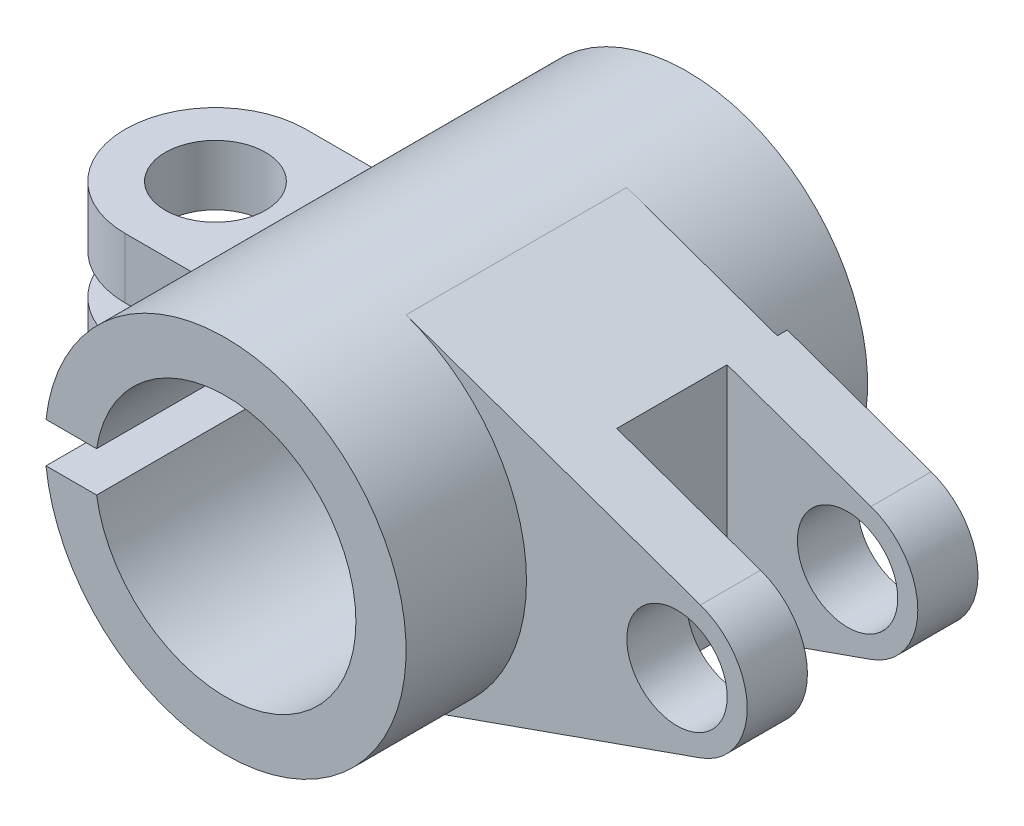
ISO-10303-21;
HEADER;
FILE_DESCRIPTION(('STEP AP214'),'2;1');
FILE_NAME('part.step','',(''),(''),'','','');
FILE_SCHEMA(('AUTOMOTIVE_DESIGN { 1 0 10303 214 1 1 1 1 }'));
ENDSEC;
DATA;
#1=APPLICATION_CONTEXT('core data for automotive mechanical design processes');
#2=APPLICATION_PROTOCOL_DEFINITION('international standard','automotive_design',2000,#1);
#3=PRODUCT_CONTEXT('',#1,'mechanical');
#4=PRODUCT('Part','Part','',(#3));
#5=PRODUCT_RELATED_PRODUCT_CATEGORY('part','',(#4));
#6=PRODUCT_DEFINITION_FORMATION('','',#4);
#7=PRODUCT_DEFINITION_CONTEXT('part definition',#1,'design');
#8=PRODUCT_DEFINITION('design','',#6,#7);
#9=PRODUCT_DEFINITION_SHAPE('','',#8);
#10=(LENGTH_UNIT() NAMED_UNIT(*) SI_UNIT(.MILLI.,.METRE.));
#11=(NAMED_UNIT(*) PLANE_ANGLE_UNIT() SI_UNIT($,.RADIAN.));
#12=(NAMED_UNIT(*) SI_UNIT($,.STERADIAN.) SOLID_ANGLE_UNIT());
#13=UNCERTAINTY_MEASURE_WITH_UNIT(LENGTH_MEASURE(1.E-05),#10,'distance_accuracy_value','');
#14=(GEOMETRIC_REPRESENTATION_CONTEXT(3) GLOBAL_UNCERTAINTY_ASSIGNED_CONTEXT((#13)) GLOBAL_UNIT_ASSIGNED_CONTEXT((#10,
#11,#12)) REPRESENTATION_CONTEXT('',''));
#15=CARTESIAN_POINT('',(0.,0.,0.));
#16=DIRECTION('',(0.,0.,1.));
#17=DIRECTION('',(1.,0.,0.));
#18=AXIS2_PLACEMENT_3D('',#15,#16,#17);
#19=CARTESIAN_POINT('',(-24.,-2.,0.));
#20=DIRECTION('',(0.,1.,0.));
#21=DIRECTION('',(0.,0.,1.));
#22=AXIS2_PLACEMENT_3D('',#19,#20,#21);
#23=CYLINDRICAL_SURFACE('',#22,9.);
#24=DIRECTION('',(0.,1.,0.));
#25=VECTOR('',#24,1.);
#26=CARTESIAN_POINT('',(-24.,0.,9.));
#27=LINE('',#26,#25);
#28=CARTESIAN_POINT('',(-24.,-2.,9.));
#29=VERTEX_POINT('',#28);
#30=CARTESIAN_POINT('',(-24.,-8.00000000000001,9.));
#31=VERTEX_POINT('',#30);
#32=EDGE_CURVE('E440',#29,#31,#27,.F.);
#33=ORIENTED_EDGE('',*,*,#32,.F.);
#34=CARTESIAN_POINT('',(-24.,-2.,0.));
#35=DIRECTION('',(0.,1.,0.));
#36=DIRECTION('',(-1.,0.,0.));
#37=AXIS2_PLACEMENT_3D('',#34,#35,#36);
#38=CIRCLE('',#37,9.);
#39=CARTESIAN_POINT('',(-24.,-2.,-9.));
#40=VERTEX_POINT('',#39);
#41=EDGE_CURVE('E57',#40,#29,#38,.T.);
#42=ORIENTED_EDGE('',*,*,#41,.F.);
#43=DIRECTION('',(0.,-1.,0.));
#44=VECTOR('',#43,1.);
#45=CARTESIAN_POINT('',(-24.,-2.,-9.));
#46=LINE('',#45,#44);
#47=CARTESIAN_POINT('',(-24.,-8.00000000000001,-9.));
#48=VERTEX_POINT('',#47);
#49=EDGE_CURVE('E444',#48,#40,#46,.F.);
#50=ORIENTED_EDGE('',*,*,#49,.F.);
#51=CARTESIAN_POINT('',(-24.,-8.00000000000001,0.));
#52=DIRECTION('',(0.,-1.,0.));
#53=DIRECTION('',(1.,0.,0.));
#54=AXIS2_PLACEMENT_3D('',#51,#52,#53);
#55=CIRCLE('',#54,9.);
#56=EDGE_CURVE('E11',#31,#48,#55,.T.);
#57=ORIENTED_EDGE('',*,*,#56,.F.);
#58=EDGE_LOOP('',(#33,#42,#50,#57));
#59=FACE_BOUND('',#58,.T.);
#60=ADVANCED_FACE('F47',(#59),#23,.T.);
#61=CARTESIAN_POINT('',(-24.,2.,0.));
#62=DIRECTION('',(0.,-1.,0.));
#63=DIRECTION('',(0.,0.,-1.));
#64=AXIS2_PLACEMENT_3D('',#61,#62,#63);
#65=CYLINDRICAL_SURFACE('',#64,9.);
#66=DIRECTION('',(0.,-1.,0.));
#67=VECTOR('',#66,1.);
#68=CARTESIAN_POINT('',(-24.,0.,-9.));
#69=LINE('',#68,#67);
#70=CARTESIAN_POINT('',(-24.,2.,-9.));
#71=VERTEX_POINT('',#70);
#72=CARTESIAN_POINT('',(-24.,8.,-9.));
#73=VERTEX_POINT('',#72);
#74=EDGE_CURVE('E428',#71,#73,#69,.F.);
#75=ORIENTED_EDGE('',*,*,#74,.F.);
#76=CARTESIAN_POINT('',(-24.,2.,0.));
#77=DIRECTION('',(0.,1.,0.));
#78=DIRECTION('',(0.,0.,1.));
#79=AXIS2_PLACEMENT_3D('',#76,#77,#78);
#80=CIRCLE('',#79,9.);
#81=CARTESIAN_POINT('',(-24.,2.,9.));
#82=VERTEX_POINT('',#81);
#83=EDGE_CURVE('E435',#82,#71,#80,.F.);
#84=ORIENTED_EDGE('',*,*,#83,.F.);
#85=DIRECTION('',(0.,1.,0.));
#86=VECTOR('',#85,1.);
#87=CARTESIAN_POINT('',(-24.,2.,9.));
#88=LINE('',#87,#86);
#89=CARTESIAN_POINT('',(-24.,8.,9.));
#90=VERTEX_POINT('',#89);
#91=EDGE_CURVE('E432',#90,#82,#88,.F.);
#92=ORIENTED_EDGE('',*,*,#91,.F.);
#93=CARTESIAN_POINT('',(-24.,8.,0.));
#94=DIRECTION('',(0.,-1.,0.));
#95=DIRECTION('',(1.,0.,0.));
#96=AXIS2_PLACEMENT_3D('',#93,#94,#95);
#97=CIRCLE('',#96,9.);
#98=EDGE_CURVE('E202',#73,#90,#97,.F.);
#99=ORIENTED_EDGE('',*,*,#98,.F.);
#100=EDGE_LOOP('',(#75,#84,#92,#99));
#101=FACE_BOUND('',#100,.T.);
#102=ADVANCED_FACE('F522',(#101),#65,.T.);
#103=CARTESIAN_POINT('',(21.,0.,11.));
#104=DIRECTION('',(1.,0.,0.));
#105=DIRECTION('',(0.,1.,0.));
#106=AXIS2_PLACEMENT_3D('',#103,#104,#105);
#107=PLANE('',#106);
#108=DIRECTION('',(0.,-1.,0.));
#109=VECTOR('',#108,1.);
#110=CARTESIAN_POINT('',(21.,0.,-6.));
#111=LINE('',#110,#109);
#112=CARTESIAN_POINT('',(21.,11.667261889578,-6.));
#113=VERTEX_POINT('',#112);
#114=CARTESIAN_POINT('',(21.,-11.667261889578,-6.));
#115=VERTEX_POINT('',#114);
#116=EDGE_CURVE('E265',#113,#115,#111,.T.);
#117=ORIENTED_EDGE('',*,*,#116,.F.);
#118=DIRECTION('',(0.,0.,-1.));
#119=VECTOR('',#118,1.);
#120=CARTESIAN_POINT('',(21.,11.667261889578,11.));
#121=LINE('',#120,#119);
#122=CARTESIAN_POINT('',(21.,11.667261889578,5.));
#123=VERTEX_POINT('',#122);
#124=EDGE_CURVE('E370',#123,#113,#121,.T.);
#125=ORIENTED_EDGE('',*,*,#124,.F.);
#126=DIRECTION('',(0.,-1.,0.));
#127=VECTOR('',#126,1.);
#128=CARTESIAN_POINT('',(21.,0.,5.));
#129=LINE('',#128,#127);
#130=CARTESIAN_POINT('',(21.,-11.667261889578,5.));
#131=VERTEX_POINT('',#130);
#132=EDGE_CURVE('E313',#123,#131,#129,.T.);
#133=ORIENTED_EDGE('',*,*,#132,.T.);
#134=DIRECTION('',(0.,0.,-1.));
#135=VECTOR('',#134,1.);
#136=CARTESIAN_POINT('',(21.,-11.667261889578,11.));
#137=LINE('',#136,#135);
#138=EDGE_CURVE('E374',#131,#115,#137,.T.);
#139=ORIENTED_EDGE('',*,*,#138,.T.);
#140=EDGE_LOOP('',(#117,#125,#133,#139));
#141=FACE_BOUND('',#140,.T.);
#142=ADVANCED_FACE('F527',(#141),#107,.T.);
#143=CARTESIAN_POINT('',(0.,0.,23.));
#144=DIRECTION('',(0.,0.,-1.));
#145=DIRECTION('',(-1.,0.,0.));
#146=AXIS2_PLACEMENT_3D('',#143,#144,#145);
#147=CYLINDRICAL_SURFACE('',#146,18.);
#148=DIRECTION('',(0.,0.,-1.));
#149=VECTOR('',#148,1.);
#150=CARTESIAN_POINT('',(6.00000000000001,-16.9705627484772,11.));
#151=LINE('',#150,#149);
#152=CARTESIAN_POINT('',(6.00000000000001,-16.9705627484771,11.));
#153=VERTEX_POINT('',#152);
#154=CARTESIAN_POINT('',(6.,-16.9705627484771,-11.));
#155=VERTEX_POINT('',#154);
#156=EDGE_CURVE('E378',#153,#155,#151,.T.);
#157=ORIENTED_EDGE('',*,*,#156,.F.);
#158=CARTESIAN_POINT('',(0.,0.,11.));
#159=DIRECTION('',(0.,0.,1.));
#160=DIRECTION('',(1.,0.,0.));
#161=AXIS2_PLACEMENT_3D('',#158,#159,#160);
#162=CIRCLE('',#161,18.);
#163=CARTESIAN_POINT('',(6.00000000000001,16.9705627484771,11.));
#164=VERTEX_POINT('',#163);
#165=EDGE_CURVE('E343',#153,#164,#162,.T.);
#166=ORIENTED_EDGE('',*,*,#165,.T.);
#167=DIRECTION('',(0.,0.,-1.));
#168=VECTOR('',#167,1.);
#169=CARTESIAN_POINT('',(6.00000000000001,16.9705627484772,11.));
#170=LINE('',#169,#168);
#171=CARTESIAN_POINT('',(6.00000000000001,16.9705627484772,-11.));
#172=VERTEX_POINT('',#171);
#173=EDGE_CURVE('E353',#164,#172,#170,.T.);
#174=ORIENTED_EDGE('',*,*,#173,.T.);
#175=CARTESIAN_POINT('',(0.,0.,-11.));
#176=DIRECTION('',(0.,0.,1.));
#177=DIRECTION('',(1.,0.,0.));
#178=AXIS2_PLACEMENT_3D('',#175,#176,#177);
#179=CIRCLE('',#178,18.);
#180=EDGE_CURVE('E342',#155,#172,#179,.T.);
#181=ORIENTED_EDGE('',*,*,#180,.F.);
#182=EDGE_LOOP('',(#157,#166,#174,#181));
#183=FACE_BOUND('',#182,.T.);
#184=DIRECTION('',(0.,0.,-1.));
#185=VECTOR('',#184,1.);
#186=CARTESIAN_POINT('',(-16.1245154965971,8.,9.));
#187=LINE('',#186,#185);
#188=CARTESIAN_POINT('',(-16.1245154965971,8.,9.));
#189=VERTEX_POINT('',#188);
#190=CARTESIAN_POINT('',(-16.1245154965971,8.,-9.));
#191=VERTEX_POINT('',#190);
#192=EDGE_CURVE('E200',#189,#191,#187,.T.);
#193=ORIENTED_EDGE('',*,*,#192,.F.);
#194=CARTESIAN_POINT('',(0.,0.,9.));
#195=DIRECTION('',(0.,0.,1.));
#196=DIRECTION('',(1.,0.,0.));
#197=AXIS2_PLACEMENT_3D('',#194,#195,#196);
#198=CIRCLE('',#197,18.);
#199=CARTESIAN_POINT('',(-17.8885438199983,2.,9.));
#200=VERTEX_POINT('',#199);
#201=EDGE_CURVE('E208',#189,#200,#198,.T.);
#202=ORIENTED_EDGE('',*,*,#201,.T.);
#203=DIRECTION('',(0.,0.,-1.));
#204=VECTOR('',#203,1.);
#205=CARTESIAN_POINT('',(-17.8885438199983,2.,23.));
#206=LINE('',#205,#204);
#207=CARTESIAN_POINT('',(-17.8885438199983,2.,23.));
#208=VERTEX_POINT('',#207);
#209=EDGE_CURVE('E425',#208,#200,#206,.T.);
#210=ORIENTED_EDGE('',*,*,#209,.F.);
#211=CARTESIAN_POINT('',(0.,0.,23.));
#212=DIRECTION('',(0.,0.,1.));
#213=DIRECTION('',(1.,0.,0.));
#214=AXIS2_PLACEMENT_3D('',#211,#212,#213);
#215=CIRCLE('',#214,18.);
#216=CARTESIAN_POINT('',(-17.8885438199983,-2.,23.));
#217=VERTEX_POINT('',#216);
#218=EDGE_CURVE('E383',#217,#208,#215,.T.);
#219=ORIENTED_EDGE('',*,*,#218,.F.);
#220=DIRECTION('',(0.,0.,-1.));
#221=VECTOR('',#220,1.);
#222=CARTESIAN_POINT('',(-17.8885438199983,-2.,23.));
#223=LINE('',#222,#221);
#224=CARTESIAN_POINT('',(-17.8885438199983,-2.,9.));
#225=VERTEX_POINT('',#224);
#226=EDGE_CURVE('E414',#217,#225,#223,.T.);
#227=ORIENTED_EDGE('',*,*,#226,.T.);
#228=CARTESIAN_POINT('',(0.,0.,9.));
#229=DIRECTION('',(0.,0.,1.));
#230=DIRECTION('',(1.,0.,0.));
#231=AXIS2_PLACEMENT_3D('',#228,#229,#230);
#232=CIRCLE('',#231,18.);
#233=CARTESIAN_POINT('',(-16.1245154965971,-8.00000000000001,9.));
#234=VERTEX_POINT('',#233);
#235=EDGE_CURVE('E236',#225,#234,#232,.T.);
#236=ORIENTED_EDGE('',*,*,#235,.T.);
#237=DIRECTION('',(0.,0.,-1.));
#238=VECTOR('',#237,1.);
#239=CARTESIAN_POINT('',(-16.1245154965971,-8.00000000000001,9.));
#240=LINE('',#239,#238);
#241=CARTESIAN_POINT('',(-16.1245154965971,-8.00000000000001,-9.));
#242=VERTEX_POINT('',#241);
#243=EDGE_CURVE('E246',#234,#242,#240,.T.);
#244=ORIENTED_EDGE('',*,*,#243,.T.);
#245=CARTESIAN_POINT('',(0.,0.,-9.));
#246=DIRECTION('',(0.,0.,1.));
#247=DIRECTION('',(1.,0.,0.));
#248=AXIS2_PLACEMENT_3D('',#245,#246,#247);
#249=CIRCLE('',#248,18.);
#250=CARTESIAN_POINT('',(-17.8885438199983,-2.,-9.));
#251=VERTEX_POINT('',#250);
#252=EDGE_CURVE('E247',#251,#242,#249,.T.);
#253=ORIENTED_EDGE('',*,*,#252,.F.);
#254=CARTESIAN_POINT('',(-17.8885438199983,-2.,-23.));
#255=VERTEX_POINT('',#254);
#256=EDGE_CURVE('E399',#251,#255,#223,.T.);
#257=ORIENTED_EDGE('',*,*,#256,.T.);
#258=CARTESIAN_POINT('',(0.,0.,-23.));
#259=DIRECTION('',(0.,0.,1.));
#260=DIRECTION('',(1.,0.,0.));
#261=AXIS2_PLACEMENT_3D('',#258,#259,#260);
#262=CIRCLE('',#261,18.);
#263=CARTESIAN_POINT('',(-17.8885438199983,2.,-23.));
#264=VERTEX_POINT('',#263);
#265=EDGE_CURVE('E382',#255,#264,#262,.T.);
#266=ORIENTED_EDGE('',*,*,#265,.T.);
#267=CARTESIAN_POINT('',(-17.8885438199983,2.,-9.));
#268=VERTEX_POINT('',#267);
#269=EDGE_CURVE('E424',#268,#264,#206,.T.);
#270=ORIENTED_EDGE('',*,*,#269,.F.);
#271=CARTESIAN_POINT('',(0.,0.,-9.));
#272=DIRECTION('',(0.,0.,1.));
#273=DIRECTION('',(1.,0.,0.));
#274=AXIS2_PLACEMENT_3D('',#271,#272,#273);
#275=CIRCLE('',#274,18.);
#276=EDGE_CURVE('E223',#191,#268,#275,.T.);
#277=ORIENTED_EDGE('',*,*,#276,.F.);
#278=EDGE_LOOP('',(#193,#202,#210,#219,#227,#236,#244,#253,#257,#266,#270,#277));
#279=FACE_BOUND('',#278,.T.);
#280=ADVANCED_FACE('F220',(#183,#279),#147,.T.);
#281=CARTESIAN_POINT('',(0.,2.,23.));
#282=DIRECTION('',(0.,1.,0.));
#283=DIRECTION('',(0.,0.,1.));
#284=AXIS2_PLACEMENT_3D('',#281,#282,#283);
#285=PLANE('',#284);
#286=CARTESIAN_POINT('',(-24.,2.,0.));
#287=DIRECTION('',(0.,1.,0.));
#288=DIRECTION('',(0.,0.,1.));
#289=AXIS2_PLACEMENT_3D('',#286,#287,#288);
#290=CIRCLE('',#289,4.99999999999999);
#291=CARTESIAN_POINT('',(-24.,2.,4.99999999999999));
#292=VERTEX_POINT('',#291);
#293=EDGE_CURVE('E491',#292,#292,#290,.T.);
#294=ORIENTED_EDGE('',*,*,#293,.T.);
#295=EDGE_LOOP('',(#294));
#296=FACE_BOUND('',#295,.T.);
#297=DIRECTION('',(1.,0.,0.));
#298=VECTOR('',#297,1.);
#299=CARTESIAN_POINT('',(0.,2.,9.));
#300=LINE('',#299,#298);
#301=EDGE_CURVE('E207',#82,#200,#300,.T.);
#302=ORIENTED_EDGE('',*,*,#301,.F.);
#303=ORIENTED_EDGE('',*,*,#83,.T.);
#304=DIRECTION('',(1.,0.,0.));
#305=VECTOR('',#304,1.);
#306=CARTESIAN_POINT('',(0.,2.,-9.));
#307=LINE('',#306,#305);
#308=EDGE_CURVE('E217',#71,#268,#307,.T.);
#309=ORIENTED_EDGE('',*,*,#308,.T.);
#310=ORIENTED_EDGE('',*,*,#269,.T.);
#311=DIRECTION('',(1.,0.,0.));
#312=VECTOR('',#311,1.);
#313=CARTESIAN_POINT('',(0.,2.,-23.));
#314=LINE('',#313,#312);
#315=CARTESIAN_POINT('',(-12.8452325786651,2.,-23.));
#316=VERTEX_POINT('',#315);
#317=EDGE_CURVE('E403',#264,#316,#314,.T.);
#318=ORIENTED_EDGE('',*,*,#317,.T.);
#319=DIRECTION('',(0.,0.,-1.));
#320=VECTOR('',#319,1.);
#321=CARTESIAN_POINT('',(-12.8452325786651,2.,23.));
#322=LINE('',#321,#320);
#323=CARTESIAN_POINT('',(-12.8452325786651,2.,23.));
#324=VERTEX_POINT('',#323);
#325=EDGE_CURVE('E421',#324,#316,#322,.T.);
#326=ORIENTED_EDGE('',*,*,#325,.F.);
#327=DIRECTION('',(1.,0.,0.));
#328=VECTOR('',#327,1.);
#329=CARTESIAN_POINT('',(0.,2.,23.));
#330=LINE('',#329,#328);
#331=EDGE_CURVE('E387',#208,#324,#330,.T.);
#332=ORIENTED_EDGE('',*,*,#331,.F.);
#333=ORIENTED_EDGE('',*,*,#209,.T.);
#334=EDGE_LOOP('',(#302,#303,#309,#310,#318,#326,#332,#333));
#335=FACE_BOUND('',#334,.T.);
#336=ADVANCED_FACE('F476',(#296,#335),#285,.F.);
#337=CARTESIAN_POINT('',(0.,0.,23.));
#338=DIRECTION('',(0.,0.,-1.));
#339=DIRECTION('',(-1.,0.,0.));
#340=AXIS2_PLACEMENT_3D('',#337,#338,#339);
#341=CYLINDRICAL_SURFACE('',#340,13.);
#342=CARTESIAN_POINT('',(0.,0.,-23.));
#343=DIRECTION('',(0.,0.,1.));
#344=DIRECTION('',(1.,0.,0.));
#345=AXIS2_PLACEMENT_3D('',#342,#343,#344);
#346=CIRCLE('',#345,13.);
#347=CARTESIAN_POINT('',(-12.8452325786651,-2.,-23.));
#348=VERTEX_POINT('',#347);
#349=EDGE_CURVE('E407',#348,#316,#346,.T.);
#350=ORIENTED_EDGE('',*,*,#349,.F.);
#351=DIRECTION('',(0.,0.,-1.));
#352=VECTOR('',#351,1.);
#353=CARTESIAN_POINT('',(-12.8452325786651,-2.,23.));
#354=LINE('',#353,#352);
#355=CARTESIAN_POINT('',(-12.8452325786651,-2.,23.));
#356=VERTEX_POINT('',#355);
#357=EDGE_CURVE('E418',#356,#348,#354,.T.);
#358=ORIENTED_EDGE('',*,*,#357,.F.);
#359=CARTESIAN_POINT('',(0.,0.,23.));
#360=DIRECTION('',(0.,0.,1.));
#361=DIRECTION('',(1.,0.,0.));
#362=AXIS2_PLACEMENT_3D('',#359,#360,#361);
#363=CIRCLE('',#362,13.);
#364=EDGE_CURVE('E391',#356,#324,#363,.T.);
#365=ORIENTED_EDGE('',*,*,#364,.T.);
#366=ORIENTED_EDGE('',*,*,#325,.T.);
#367=EDGE_LOOP('',(#350,#358,#365,#366));
#368=FACE_BOUND('',#367,.T.);
#369=ADVANCED_FACE('F473',(#368),#341,.F.);
#370=CARTESIAN_POINT('',(0.,-2.,23.));
#371=DIRECTION('',(0.,1.,0.));
#372=DIRECTION('',(-1.,0.,0.));
#373=AXIS2_PLACEMENT_3D('',#370,#371,#372);
#374=PLANE('',#373);
#375=CARTESIAN_POINT('',(-24.,-2.,0.));
#376=DIRECTION('',(0.,1.,0.));
#377=DIRECTION('',(-1.,0.,0.));
#378=AXIS2_PLACEMENT_3D('',#375,#376,#377);
#379=CIRCLE('',#378,4.99999999999999);
#380=CARTESIAN_POINT('',(-29.,-2.,0.));
#381=VERTEX_POINT('',#380);
#382=EDGE_CURVE('E252',#381,#381,#379,.T.);
#383=ORIENTED_EDGE('',*,*,#382,.F.);
#384=EDGE_LOOP('',(#383));
#385=FACE_BOUND('',#384,.T.);
#386=DIRECTION('',(1.,0.,0.));
#387=VECTOR('',#386,1.);
#388=CARTESIAN_POINT('',(0.,-2.,-9.));
#389=LINE('',#388,#387);
#390=EDGE_CURVE('E251',#40,#251,#389,.T.);
#391=ORIENTED_EDGE('',*,*,#390,.F.);
#392=ORIENTED_EDGE('',*,*,#41,.T.);
#393=DIRECTION('',(1.,0.,0.));
#394=VECTOR('',#393,1.);
#395=CARTESIAN_POINT('',(0.,-2.,9.));
#396=LINE('',#395,#394);
#397=EDGE_CURVE('E239',#29,#225,#396,.T.);
#398=ORIENTED_EDGE('',*,*,#397,.T.);
#399=ORIENTED_EDGE('',*,*,#226,.F.);
#400=DIRECTION('',(1.,0.,0.));
#401=VECTOR('',#400,1.);
#402=CARTESIAN_POINT('',(0.,-2.,23.));
#403=LINE('',#402,#401);
#404=EDGE_CURVE('E395',#217,#356,#403,.T.);
#405=ORIENTED_EDGE('',*,*,#404,.T.);
#406=ORIENTED_EDGE('',*,*,#357,.T.);
#407=DIRECTION('',(1.,0.,0.));
#408=VECTOR('',#407,1.);
#409=CARTESIAN_POINT('',(0.,-2.,-23.));
#410=LINE('',#409,#408);
#411=EDGE_CURVE('E388',#255,#348,#410,.T.);
#412=ORIENTED_EDGE('',*,*,#411,.F.);
#413=ORIENTED_EDGE('',*,*,#256,.F.);
#414=EDGE_LOOP('',(#391,#392,#398,#399,#405,#406,#412,#413));
#415=FACE_BOUND('',#414,.T.);
#416=ADVANCED_FACE('F450',(#385,#415),#374,.T.);
#417=CARTESIAN_POINT('',(0.,0.,23.));
#418=DIRECTION('',(0.,0.,1.));
#419=DIRECTION('',(1.,0.,0.));
#420=AXIS2_PLACEMENT_3D('',#417,#418,#419);
#421=PLANE('',#420);
#422=ORIENTED_EDGE('',*,*,#218,.T.);
#423=ORIENTED_EDGE('',*,*,#331,.T.);
#424=ORIENTED_EDGE('',*,*,#364,.F.);
#425=ORIENTED_EDGE('',*,*,#404,.F.);
#426=EDGE_LOOP('',(#422,#423,#424,#425));
#427=FACE_BOUND('',#426,.T.);
#428=ADVANCED_FACE('F548',(#427),#421,.T.);
#429=CARTESIAN_POINT('',(0.,0.,-23.));
#430=DIRECTION('',(0.,0.,1.));
#431=DIRECTION('',(1.,0.,0.));
#432=AXIS2_PLACEMENT_3D('',#429,#430,#431);
#433=PLANE('',#432);
#434=ORIENTED_EDGE('',*,*,#265,.F.);
#435=ORIENTED_EDGE('',*,*,#411,.T.);
#436=ORIENTED_EDGE('',*,*,#349,.T.);
#437=ORIENTED_EDGE('',*,*,#317,.F.);
#438=EDGE_LOOP('',(#434,#435,#436,#437));
#439=FACE_BOUND('',#438,.T.);
#440=ADVANCED_FACE('F468',(#439),#433,.F.);
#441=CARTESIAN_POINT('',(6.00000000000001,-16.9705627484772,11.));
#442=DIRECTION('',(-0.333333333333334,0.942809041582063,0.));
#443=DIRECTION('',(-0.942809041582063,-0.333333333333334,0.));
#444=AXIS2_PLACEMENT_3D('',#441,#442,#443);
#445=PLANE('',#444);
#446=DIRECTION('',(0.942809041582063,0.333333333333334,0.));
#447=VECTOR('',#446,1.);
#448=CARTESIAN_POINT('',(6.00000000000001,-16.9705627484772,-11.));
#449=LINE('',#448,#447);
#450=CARTESIAN_POINT('',(21.,-11.667261889578,-11.));
#451=VERTEX_POINT('',#450);
#452=EDGE_CURVE('E357',#155,#451,#449,.T.);
#453=ORIENTED_EDGE('',*,*,#452,.T.);
#454=DIRECTION('',(0.,0.,1.));
#455=VECTOR('',#454,1.);
#456=CARTESIAN_POINT('',(21.,-11.667261889578,-12.));
#457=LINE('',#456,#455);
#458=CARTESIAN_POINT('',(21.,-11.667261889578,-12.));
#459=VERTEX_POINT('',#458);
#460=EDGE_CURVE('E295',#459,#451,#457,.T.);
#461=ORIENTED_EDGE('',*,*,#460,.F.);
#462=DIRECTION('',(0.942809041582063,0.333333333333334,0.));
#463=VECTOR('',#462,1.);
#464=CARTESIAN_POINT('',(6.00000000000001,-16.9705627484772,-12.));
#465=LINE('',#464,#463);
#466=CARTESIAN_POINT('',(35.3333333333333,-6.59966329107444,-12.));
#467=VERTEX_POINT('',#466);
#468=EDGE_CURVE('E264',#459,#467,#465,.T.);
#469=ORIENTED_EDGE('',*,*,#468,.T.);
#470=DIRECTION('',(0.,0.,1.));
#471=VECTOR('',#470,1.);
#472=CARTESIAN_POINT('',(35.3333333333333,-6.59966329107444,-12.));
#473=LINE('',#472,#471);
#474=CARTESIAN_POINT('',(35.3333333333333,-6.59966329107444,-6.));
#475=VERTEX_POINT('',#474);
#476=EDGE_CURVE('E279',#467,#475,#473,.T.);
#477=ORIENTED_EDGE('',*,*,#476,.T.);
#478=DIRECTION('',(0.942809041582063,0.333333333333334,0.));
#479=VECTOR('',#478,1.);
#480=CARTESIAN_POINT('',(6.00000000000001,-16.9705627484772,-6.));
#481=LINE('',#480,#479);
#482=EDGE_CURVE('E230',#115,#475,#481,.T.);
#483=ORIENTED_EDGE('',*,*,#482,.F.);
#484=ORIENTED_EDGE('',*,*,#138,.F.);
#485=DIRECTION('',(0.942809041582063,0.333333333333334,0.));
#486=VECTOR('',#485,1.);
#487=CARTESIAN_POINT('',(6.00000000000001,-16.9705627484772,5.));
#488=LINE('',#487,#486);
#489=CARTESIAN_POINT('',(35.3333333333333,-6.59966329107444,5.));
#490=VERTEX_POINT('',#489);
#491=EDGE_CURVE('E321',#131,#490,#488,.T.);
#492=ORIENTED_EDGE('',*,*,#491,.T.);
#493=DIRECTION('',(0.,0.,-1.));
#494=VECTOR('',#493,1.);
#495=CARTESIAN_POINT('',(35.3333333333333,-6.59966329107444,11.));
#496=LINE('',#495,#494);
#497=CARTESIAN_POINT('',(35.3333333333333,-6.59966329107444,11.));
#498=VERTEX_POINT('',#497);
#499=EDGE_CURVE('E338',#498,#490,#496,.T.);
#500=ORIENTED_EDGE('',*,*,#499,.F.);
#501=DIRECTION('',(0.942809041582063,0.333333333333334,0.));
#502=VECTOR('',#501,1.);
#503=CARTESIAN_POINT('',(6.00000000000001,-16.9705627484772,11.));
#504=LINE('',#503,#502);
#505=EDGE_CURVE('E346',#153,#498,#504,.T.);
#506=ORIENTED_EDGE('',*,*,#505,.F.);
#507=ORIENTED_EDGE('',*,*,#156,.T.);
#508=EDGE_LOOP('',(#453,#461,#469,#477,#483,#484,#492,#500,#506,#507));
#509=FACE_BOUND('',#508,.T.);
#510=ADVANCED_FACE('F552',(#509),#445,.F.);
#511=CARTESIAN_POINT('',(6.00000000000001,16.9705627484772,11.));
#512=DIRECTION('',(0.333333333333333,0.942809041582063,0.));
#513=DIRECTION('',(-0.942809041582063,0.333333333333333,0.));
#514=AXIS2_PLACEMENT_3D('',#511,#512,#513);
#515=PLANE('',#514);
#516=DIRECTION('',(0.942809041582063,-0.333333333333333,0.));
#517=VECTOR('',#516,1.);
#518=CARTESIAN_POINT('',(6.00000000000001,16.9705627484772,-11.));
#519=LINE('',#518,#517);
#520=CARTESIAN_POINT('',(21.,11.667261889578,-11.));
#521=VERTEX_POINT('',#520);
#522=EDGE_CURVE('E347',#172,#521,#519,.T.);
#523=ORIENTED_EDGE('',*,*,#522,.F.);
#524=ORIENTED_EDGE('',*,*,#173,.F.);
#525=DIRECTION('',(0.942809041582063,-0.333333333333333,0.));
#526=VECTOR('',#525,1.);
#527=CARTESIAN_POINT('',(6.00000000000001,16.9705627484772,11.));
#528=LINE('',#527,#526);
#529=CARTESIAN_POINT('',(35.3333333333333,6.59966329107445,11.));
#530=VERTEX_POINT('',#529);
#531=EDGE_CURVE('E350',#164,#530,#528,.T.);
#532=ORIENTED_EDGE('',*,*,#531,.T.);
#533=DIRECTION('',(0.,0.,-1.));
#534=VECTOR('',#533,1.);
#535=CARTESIAN_POINT('',(35.3333333333333,6.59966329107445,11.));
#536=LINE('',#535,#534);
#537=CARTESIAN_POINT('',(35.3333333333333,6.59966329107445,5.));
#538=VERTEX_POINT('',#537);
#539=EDGE_CURVE('E317',#530,#538,#536,.T.);
#540=ORIENTED_EDGE('',*,*,#539,.T.);
#541=DIRECTION('',(0.942809041582063,-0.333333333333333,0.));
#542=VECTOR('',#541,1.);
#543=CARTESIAN_POINT('',(6.00000000000001,16.9705627484772,5.));
#544=LINE('',#543,#542);
#545=EDGE_CURVE('E329',#123,#538,#544,.T.);
#546=ORIENTED_EDGE('',*,*,#545,.F.);
#547=ORIENTED_EDGE('',*,*,#124,.T.);
#548=DIRECTION('',(0.942809041582063,-0.333333333333333,0.));
#549=VECTOR('',#548,1.);
#550=CARTESIAN_POINT('',(6.00000000000001,16.9705627484772,-6.));
#551=LINE('',#550,#549);
#552=CARTESIAN_POINT('',(35.3333333333333,6.59966329107445,-6.));
#553=VERTEX_POINT('',#552);
#554=EDGE_CURVE('E288',#113,#553,#551,.T.);
#555=ORIENTED_EDGE('',*,*,#554,.T.);
#556=DIRECTION('',(0.,0.,1.));
#557=VECTOR('',#556,1.);
#558=CARTESIAN_POINT('',(35.3333333333333,6.59966329107445,-12.));
#559=LINE('',#558,#557);
#560=CARTESIAN_POINT('',(35.3333333333333,6.59966329107445,-12.));
#561=VERTEX_POINT('',#560);
#562=EDGE_CURVE('E303',#561,#553,#559,.T.);
#563=ORIENTED_EDGE('',*,*,#562,.F.);
#564=DIRECTION('',(0.942809041582063,-0.333333333333333,0.));
#565=VECTOR('',#564,1.);
#566=CARTESIAN_POINT('',(6.00000000000001,16.9705627484772,-12.));
#567=LINE('',#566,#565);
#568=CARTESIAN_POINT('',(21.,11.667261889578,-12.));
#569=VERTEX_POINT('',#568);
#570=EDGE_CURVE('E273',#569,#561,#567,.T.);
#571=ORIENTED_EDGE('',*,*,#570,.F.);
#572=DIRECTION('',(0.,0.,1.));
#573=VECTOR('',#572,1.);
#574=CARTESIAN_POINT('',(21.,11.667261889578,-12.));
#575=LINE('',#574,#573);
#576=EDGE_CURVE('E299',#569,#521,#575,.T.);
#577=ORIENTED_EDGE('',*,*,#576,.T.);
#578=EDGE_LOOP('',(#523,#524,#532,#540,#546,#547,#555,#563,#571,#577));
#579=FACE_BOUND('',#578,.T.);
#580=ADVANCED_FACE('F557',(#579),#515,.T.);
#581=CARTESIAN_POINT('',(0.,0.,11.));
#582=DIRECTION('',(0.,0.,1.));
#583=DIRECTION('',(1.,0.,0.));
#584=AXIS2_PLACEMENT_3D('',#581,#582,#583);
#585=PLANE('',#584);
#586=ORIENTED_EDGE('',*,*,#165,.F.);
#587=ORIENTED_EDGE('',*,*,#505,.T.);
#588=CARTESIAN_POINT('',(33.,0.,11.));
#589=DIRECTION('',(0.,0.,1.));
#590=DIRECTION('',(1.,0.,0.));
#591=AXIS2_PLACEMENT_3D('',#588,#589,#590);
#592=CIRCLE('',#591,7.);
#593=EDGE_CURVE('E312',#498,#530,#592,.T.);
#594=ORIENTED_EDGE('',*,*,#593,.T.);
#595=ORIENTED_EDGE('',*,*,#531,.F.);
#596=EDGE_LOOP('',(#586,#587,#594,#595));
#597=FACE_BOUND('',#596,.T.);
#598=CARTESIAN_POINT('',(33.,0.,11.));
#599=DIRECTION('',(0.,0.,1.));
#600=DIRECTION('',(1.,0.,0.));
#601=AXIS2_PLACEMENT_3D('',#598,#599,#600);
#602=CIRCLE('',#601,5.);
#603=CARTESIAN_POINT('',(38.,0.,11.));
#604=VERTEX_POINT('',#603);
#605=EDGE_CURVE('E308',#604,#604,#602,.T.);
#606=ORIENTED_EDGE('',*,*,#605,.F.);
#607=EDGE_LOOP('',(#606));
#608=FACE_BOUND('',#607,.T.);
#609=ADVANCED_FACE('F562',(#597,#608),#585,.T.);
#610=CARTESIAN_POINT('',(0.,0.,-11.));
#611=DIRECTION('',(0.,0.,1.));
#612=DIRECTION('',(1.,0.,0.));
#613=AXIS2_PLACEMENT_3D('',#610,#611,#612);
#614=PLANE('',#613);
#615=ORIENTED_EDGE('',*,*,#180,.T.);
#616=ORIENTED_EDGE('',*,*,#522,.T.);
#617=DIRECTION('',(0.,-1.,0.));
#618=VECTOR('',#617,1.);
#619=CARTESIAN_POINT('',(21.,0.,-11.));
#620=LINE('',#619,#618);
#621=EDGE_CURVE('E361',#521,#451,#620,.T.);
#622=ORIENTED_EDGE('',*,*,#621,.T.);
#623=ORIENTED_EDGE('',*,*,#452,.F.);
#624=EDGE_LOOP('',(#615,#616,#622,#623));
#625=FACE_BOUND('',#624,.T.);
#626=ADVANCED_FACE('F564',(#625),#614,.F.);
#627=CARTESIAN_POINT('',(33.,0.,11.));
#628=DIRECTION('',(0.,0.,-1.));
#629=DIRECTION('',(-1.,0.,0.));
#630=AXIS2_PLACEMENT_3D('',#627,#628,#629);
#631=CYLINDRICAL_SURFACE('',#630,7.);
#632=CARTESIAN_POINT('',(33.,0.,5.));
#633=DIRECTION('',(0.,0.,1.));
#634=DIRECTION('',(1.,0.,0.));
#635=AXIS2_PLACEMENT_3D('',#632,#633,#634);
#636=CIRCLE('',#635,7.);
#637=EDGE_CURVE('E325',#490,#538,#636,.T.);
#638=ORIENTED_EDGE('',*,*,#637,.T.);
#639=ORIENTED_EDGE('',*,*,#539,.F.);
#640=ORIENTED_EDGE('',*,*,#593,.F.);
#641=ORIENTED_EDGE('',*,*,#499,.T.);
#642=EDGE_LOOP('',(#638,#639,#640,#641));
#643=FACE_BOUND('',#642,.T.);
#644=ADVANCED_FACE('F567',(#643),#631,.T.);
#645=CARTESIAN_POINT('',(33.,0.,11.));
#646=DIRECTION('',(0.,0.,-1.));
#647=DIRECTION('',(-1.,0.,0.));
#648=AXIS2_PLACEMENT_3D('',#645,#646,#647);
#649=CYLINDRICAL_SURFACE('',#648,5.);
#650=ORIENTED_EDGE('',*,*,#605,.T.);
#651=EDGE_LOOP('',(#650));
#652=FACE_BOUND('',#651,.T.);
#653=CARTESIAN_POINT('',(33.,0.,5.));
#654=DIRECTION('',(0.,0.,1.));
#655=DIRECTION('',(1.,0.,0.));
#656=AXIS2_PLACEMENT_3D('',#653,#654,#655);
#657=CIRCLE('',#656,5.);
#658=CARTESIAN_POINT('',(38.,0.,5.));
#659=VERTEX_POINT('',#658);
#660=EDGE_CURVE('E298',#659,#659,#657,.T.);
#661=ORIENTED_EDGE('',*,*,#660,.F.);
#662=EDGE_LOOP('',(#661));
#663=FACE_BOUND('',#662,.T.);
#664=ADVANCED_FACE('F572',(#652,#663),#649,.F.);
#665=CARTESIAN_POINT('',(0.,0.,5.));
#666=DIRECTION('',(0.,0.,1.));
#667=DIRECTION('',(1.,0.,0.));
#668=AXIS2_PLACEMENT_3D('',#665,#666,#667);
#669=PLANE('',#668);
#670=ORIENTED_EDGE('',*,*,#660,.T.);
#671=EDGE_LOOP('',(#670));
#672=FACE_BOUND('',#671,.T.);
#673=ORIENTED_EDGE('',*,*,#491,.F.);
#674=ORIENTED_EDGE('',*,*,#132,.F.);
#675=ORIENTED_EDGE('',*,*,#545,.T.);
#676=ORIENTED_EDGE('',*,*,#637,.F.);
#677=EDGE_LOOP('',(#673,#674,#675,#676));
#678=FACE_BOUND('',#677,.T.);
#679=ADVANCED_FACE('F575',(#672,#678),#669,.F.);
#680=CARTESIAN_POINT('',(21.,0.,-12.));
#681=DIRECTION('',(-1.,0.,0.));
#682=DIRECTION('',(0.,-1.,0.));
#683=AXIS2_PLACEMENT_3D('',#680,#681,#682);
#684=PLANE('',#683);
#685=ORIENTED_EDGE('',*,*,#621,.F.);
#686=ORIENTED_EDGE('',*,*,#576,.F.);
#687=DIRECTION('',(0.,-1.,0.));
#688=VECTOR('',#687,1.);
#689=CARTESIAN_POINT('',(21.,0.,-12.));
#690=LINE('',#689,#688);
#691=EDGE_CURVE('E276',#569,#459,#690,.T.);
#692=ORIENTED_EDGE('',*,*,#691,.T.);
#693=ORIENTED_EDGE('',*,*,#460,.T.);
#694=EDGE_LOOP('',(#685,#686,#692,#693));
#695=FACE_BOUND('',#694,.T.);
#696=ADVANCED_FACE('F582',(#695),#684,.T.);
#697=CARTESIAN_POINT('',(33.,0.,-12.));
#698=DIRECTION('',(0.,0.,1.));
#699=DIRECTION('',(1.,0.,0.));
#700=AXIS2_PLACEMENT_3D('',#697,#698,#699);
#701=CYLINDRICAL_SURFACE('',#700,5.);
#702=CARTESIAN_POINT('',(33.,0.,-12.));
#703=DIRECTION('',(0.,0.,1.));
#704=DIRECTION('',(1.,0.,0.));
#705=AXIS2_PLACEMENT_3D('',#702,#703,#704);
#706=CIRCLE('',#705,5.);
#707=CARTESIAN_POINT('',(38.,0.,-12.));
#708=VERTEX_POINT('',#707);
#709=EDGE_CURVE('E260',#708,#708,#706,.T.);
#710=ORIENTED_EDGE('',*,*,#709,.F.);
#711=EDGE_LOOP('',(#710));
#712=FACE_BOUND('',#711,.T.);
#713=CARTESIAN_POINT('',(33.,0.,-6.));
#714=DIRECTION('',(0.,0.,1.));
#715=DIRECTION('',(1.,0.,0.));
#716=AXIS2_PLACEMENT_3D('',#713,#714,#715);
#717=CIRCLE('',#716,5.);
#718=CARTESIAN_POINT('',(38.,0.,-6.));
#719=VERTEX_POINT('',#718);
#720=EDGE_CURVE('E225',#719,#719,#717,.T.);
#721=ORIENTED_EDGE('',*,*,#720,.T.);
#722=EDGE_LOOP('',(#721));
#723=FACE_BOUND('',#722,.T.);
#724=ADVANCED_FACE('F584',(#712,#723),#701,.F.);
#725=CARTESIAN_POINT('',(33.,0.,-12.));
#726=DIRECTION('',(0.,0.,1.));
#727=DIRECTION('',(1.,0.,0.));
#728=AXIS2_PLACEMENT_3D('',#725,#726,#727);
#729=CYLINDRICAL_SURFACE('',#728,7.);
#730=CARTESIAN_POINT('',(33.,0.,-6.));
#731=DIRECTION('',(0.,0.,1.));
#732=DIRECTION('',(1.,0.,0.));
#733=AXIS2_PLACEMENT_3D('',#730,#731,#732);
#734=CIRCLE('',#733,7.);
#735=EDGE_CURVE('E284',#475,#553,#734,.T.);
#736=ORIENTED_EDGE('',*,*,#735,.F.);
#737=ORIENTED_EDGE('',*,*,#476,.F.);
#738=CARTESIAN_POINT('',(33.,0.,-12.));
#739=DIRECTION('',(0.,0.,1.));
#740=DIRECTION('',(1.,0.,0.));
#741=AXIS2_PLACEMENT_3D('',#738,#739,#740);
#742=CIRCLE('',#741,7.);
#743=EDGE_CURVE('E269',#467,#561,#742,.T.);
#744=ORIENTED_EDGE('',*,*,#743,.T.);
#745=ORIENTED_EDGE('',*,*,#562,.T.);
#746=EDGE_LOOP('',(#736,#737,#744,#745));
#747=FACE_BOUND('',#746,.T.);
#748=ADVANCED_FACE('F587',(#747),#729,.T.);
#749=CARTESIAN_POINT('',(0.,0.,-12.));
#750=DIRECTION('',(0.,0.,1.));
#751=DIRECTION('',(1.,0.,0.));
#752=AXIS2_PLACEMENT_3D('',#749,#750,#751);
#753=PLANE('',#752);
#754=ORIENTED_EDGE('',*,*,#709,.T.);
#755=EDGE_LOOP('',(#754));
#756=FACE_BOUND('',#755,.T.);
#757=ORIENTED_EDGE('',*,*,#468,.F.);
#758=ORIENTED_EDGE('',*,*,#691,.F.);
#759=ORIENTED_EDGE('',*,*,#570,.T.);
#760=ORIENTED_EDGE('',*,*,#743,.F.);
#761=EDGE_LOOP('',(#757,#758,#759,#760));
#762=FACE_BOUND('',#761,.T.);
#763=ADVANCED_FACE('F516',(#756,#762),#753,.F.);
#764=CARTESIAN_POINT('',(0.,0.,-6.));
#765=DIRECTION('',(0.,0.,1.));
#766=DIRECTION('',(1.,0.,0.));
#767=AXIS2_PLACEMENT_3D('',#764,#765,#766);
#768=PLANE('',#767);
#769=ORIENTED_EDGE('',*,*,#720,.F.);
#770=EDGE_LOOP('',(#769));
#771=FACE_BOUND('',#770,.T.);
#772=ORIENTED_EDGE('',*,*,#482,.T.);
#773=ORIENTED_EDGE('',*,*,#735,.T.);
#774=ORIENTED_EDGE('',*,*,#554,.F.);
#775=ORIENTED_EDGE('',*,*,#116,.T.);
#776=EDGE_LOOP('',(#772,#773,#774,#775));
#777=FACE_BOUND('',#776,.T.);
#778=ADVANCED_FACE('F507',(#771,#777),#768,.T.);
#779=CARTESIAN_POINT('',(0.,-8.00000000000001,9.));
#780=DIRECTION('',(0.,-1.,0.));
#781=DIRECTION('',(1.,0.,0.));
#782=AXIS2_PLACEMENT_3D('',#779,#780,#781);
#783=PLANE('',#782);
#784=CARTESIAN_POINT('',(-24.,-8.00000000000001,0.));
#785=DIRECTION('',(0.,-1.,0.));
#786=DIRECTION('',(1.,0.,0.));
#787=AXIS2_PLACEMENT_3D('',#784,#785,#786);
#788=CIRCLE('',#787,4.99999999999999);
#789=CARTESIAN_POINT('',(-19.,-8.00000000000001,0.));
#790=VERTEX_POINT('',#789);
#791=EDGE_CURVE('E51',#790,#790,#788,.T.);
#792=ORIENTED_EDGE('',*,*,#791,.F.);
#793=EDGE_LOOP('',(#792));
#794=FACE_BOUND('',#793,.T.);
#795=DIRECTION('',(-1.,0.,0.));
#796=VECTOR('',#795,1.);
#797=CARTESIAN_POINT('',(0.,-8.00000000000001,9.));
#798=LINE('',#797,#796);
#799=EDGE_CURVE('E243',#234,#31,#798,.T.);
#800=ORIENTED_EDGE('',*,*,#799,.T.);
#801=ORIENTED_EDGE('',*,*,#56,.T.);
#802=DIRECTION('',(-1.,0.,0.));
#803=VECTOR('',#802,1.);
#804=CARTESIAN_POINT('',(0.,-8.00000000000001,-9.));
#805=LINE('',#804,#803);
#806=EDGE_CURVE('E240',#242,#48,#805,.T.);
#807=ORIENTED_EDGE('',*,*,#806,.F.);
#808=ORIENTED_EDGE('',*,*,#243,.F.);
#809=EDGE_LOOP('',(#800,#801,#807,#808));
#810=FACE_BOUND('',#809,.T.);
#811=ADVANCED_FACE('F460',(#794,#810),#783,.T.);
#812=CARTESIAN_POINT('',(0.,0.,9.));
#813=DIRECTION('',(0.,0.,1.));
#814=DIRECTION('',(1.,0.,0.));
#815=AXIS2_PLACEMENT_3D('',#812,#813,#814);
#816=PLANE('',#815);
#817=ORIENTED_EDGE('',*,*,#397,.F.);
#818=ORIENTED_EDGE('',*,*,#32,.T.);
#819=ORIENTED_EDGE('',*,*,#799,.F.);
#820=ORIENTED_EDGE('',*,*,#235,.F.);
#821=EDGE_LOOP('',(#817,#818,#819,#820));
#822=FACE_BOUND('',#821,.T.);
#823=ADVANCED_FACE('F456',(#822),#816,.T.);
#824=CARTESIAN_POINT('',(0.,0.,-9.));
#825=DIRECTION('',(0.,0.,1.));
#826=DIRECTION('',(1.,0.,0.));
#827=AXIS2_PLACEMENT_3D('',#824,#825,#826);
#828=PLANE('',#827);
#829=ORIENTED_EDGE('',*,*,#806,.T.);
#830=ORIENTED_EDGE('',*,*,#49,.T.);
#831=ORIENTED_EDGE('',*,*,#390,.T.);
#832=ORIENTED_EDGE('',*,*,#252,.T.);
#833=EDGE_LOOP('',(#829,#830,#831,#832));
#834=FACE_BOUND('',#833,.T.);
#835=ADVANCED_FACE('F462',(#834),#828,.F.);
#836=CARTESIAN_POINT('',(0.,8.00000000000001,9.));
#837=DIRECTION('',(0.,-1.,0.));
#838=DIRECTION('',(1.,0.,0.));
#839=AXIS2_PLACEMENT_3D('',#836,#837,#838);
#840=PLANE('',#839);
#841=CARTESIAN_POINT('',(-24.,8.,0.));
#842=DIRECTION('',(0.,1.,0.));
#843=DIRECTION('',(0.,0.,1.));
#844=AXIS2_PLACEMENT_3D('',#841,#842,#843);
#845=CIRCLE('',#844,4.99999999999999);
#846=CARTESIAN_POINT('',(-24.,8.,4.99999999999999));
#847=VERTEX_POINT('',#846);
#848=EDGE_CURVE('E495',#847,#847,#845,.T.);
#849=ORIENTED_EDGE('',*,*,#848,.F.);
#850=EDGE_LOOP('',(#849));
#851=FACE_BOUND('',#850,.T.);
#852=DIRECTION('',(-1.,0.,0.));
#853=VECTOR('',#852,1.);
#854=CARTESIAN_POINT('',(0.,8.00000000000001,-9.));
#855=LINE('',#854,#853);
#856=EDGE_CURVE('E482',#191,#73,#855,.T.);
#857=ORIENTED_EDGE('',*,*,#856,.T.);
#858=ORIENTED_EDGE('',*,*,#98,.T.);
#859=DIRECTION('',(-1.,0.,0.));
#860=VECTOR('',#859,1.);
#861=CARTESIAN_POINT('',(0.,8.00000000000001,9.));
#862=LINE('',#861,#860);
#863=EDGE_CURVE('E195',#189,#90,#862,.T.);
#864=ORIENTED_EDGE('',*,*,#863,.F.);
#865=ORIENTED_EDGE('',*,*,#192,.T.);
#866=EDGE_LOOP('',(#857,#858,#864,#865));
#867=FACE_BOUND('',#866,.T.);
#868=ADVANCED_FACE('F198',(#851,#867),#840,.F.);
#869=CARTESIAN_POINT('',(0.,0.,9.));
#870=DIRECTION('',(0.,0.,1.));
#871=DIRECTION('',(1.,0.,0.));
#872=AXIS2_PLACEMENT_3D('',#869,#870,#871);
#873=PLANE('',#872);
#874=ORIENTED_EDGE('',*,*,#863,.T.);
#875=ORIENTED_EDGE('',*,*,#91,.T.);
#876=ORIENTED_EDGE('',*,*,#301,.T.);
#877=ORIENTED_EDGE('',*,*,#201,.F.);
#878=EDGE_LOOP('',(#874,#875,#876,#877));
#879=FACE_BOUND('',#878,.T.);
#880=ADVANCED_FACE('F211',(#879),#873,.T.);
#881=CARTESIAN_POINT('',(0.,0.,-9.));
#882=DIRECTION('',(0.,0.,1.));
#883=DIRECTION('',(1.,0.,0.));
#884=AXIS2_PLACEMENT_3D('',#881,#882,#883);
#885=PLANE('',#884);
#886=ORIENTED_EDGE('',*,*,#308,.F.);
#887=ORIENTED_EDGE('',*,*,#74,.T.);
#888=ORIENTED_EDGE('',*,*,#856,.F.);
#889=ORIENTED_EDGE('',*,*,#276,.T.);
#890=EDGE_LOOP('',(#886,#887,#888,#889));
#891=FACE_BOUND('',#890,.T.);
#892=ADVANCED_FACE('F483',(#891),#885,.F.);
#893=CARTESIAN_POINT('',(-24.,8.,0.));
#894=DIRECTION('',(0.,1.,0.));
#895=DIRECTION('',(0.,0.,1.));
#896=AXIS2_PLACEMENT_3D('',#893,#894,#895);
#897=CYLINDRICAL_SURFACE('',#896,4.99999999999999);
#898=ORIENTED_EDGE('',*,*,#382,.T.);
#899=EDGE_LOOP('',(#898));
#900=FACE_BOUND('',#899,.T.);
#901=ORIENTED_EDGE('',*,*,#791,.T.);
#902=EDGE_LOOP('',(#901));
#903=FACE_BOUND('',#902,.T.);
#904=ADVANCED_FACE('F504',(#900,#903),#897,.F.);
#905=ORIENTED_EDGE('',*,*,#848,.T.);
#906=EDGE_LOOP('',(#905));
#907=FACE_BOUND('',#906,.T.);
#908=ORIENTED_EDGE('',*,*,#293,.F.);
#909=EDGE_LOOP('',(#908));
#910=FACE_BOUND('',#909,.T.);
#911=ADVANCED_FACE('F785',(#907,#910),#897,.F.);
#912=CLOSED_SHELL('',(#60,#102,#142,#280,#336,#369,#416,#428,#440,#510,#580,#609,#626,#644,#664,
#679,#696,#724,#748,#763,#778,#811,#823,#835,#868,#880,#892,#904,#911));
#913=MANIFOLD_SOLID_BREP('B2',#912);
#914=ADVANCED_BREP_SHAPE_REPRESENTATION('',(#18,#913),#14);
#915=SHAPE_DEFINITION_REPRESENTATION(#9,#914);
ENDSEC;
END-ISO-10303-21;
